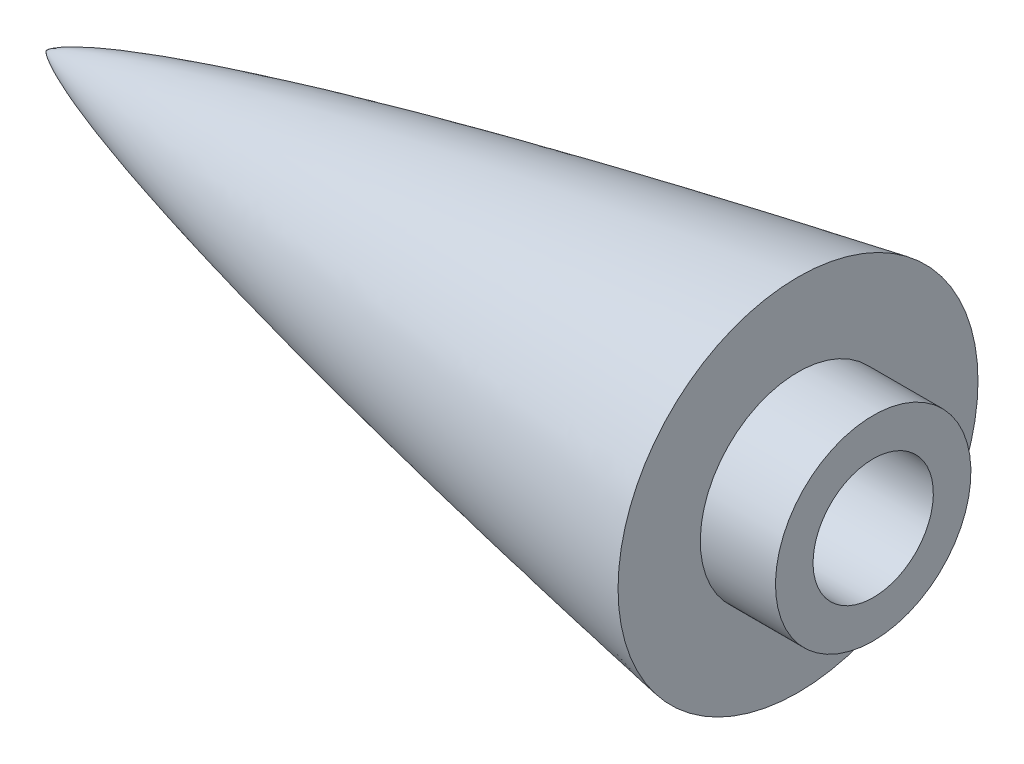
ISO-10303-21;
HEADER;
FILE_DESCRIPTION(('STEP AP214'),'2;1');
FILE_NAME('part.step','',(''),(''),'','','');
FILE_SCHEMA(('AUTOMOTIVE_DESIGN { 1 0 10303 214 1 1 1 1 }'));
ENDSEC;
DATA;
#1=APPLICATION_CONTEXT('core data for automotive mechanical design processes');
#2=APPLICATION_PROTOCOL_DEFINITION('international standard','automotive_design',2000,#1);
#3=PRODUCT_CONTEXT('',#1,'mechanical');
#4=PRODUCT('Part','Part','',(#3));
#5=PRODUCT_RELATED_PRODUCT_CATEGORY('part','',(#4));
#6=PRODUCT_DEFINITION_FORMATION('','',#4);
#7=PRODUCT_DEFINITION_CONTEXT('part definition',#1,'design');
#8=PRODUCT_DEFINITION('design','',#6,#7);
#9=PRODUCT_DEFINITION_SHAPE('','',#8);
#10=(LENGTH_UNIT() NAMED_UNIT(*) SI_UNIT(.MILLI.,.METRE.));
#11=(NAMED_UNIT(*) PLANE_ANGLE_UNIT() SI_UNIT($,.RADIAN.));
#12=(NAMED_UNIT(*) SI_UNIT($,.STERADIAN.) SOLID_ANGLE_UNIT());
#13=UNCERTAINTY_MEASURE_WITH_UNIT(LENGTH_MEASURE(1.E-05),#10,'distance_accuracy_value','');
#14=(GEOMETRIC_REPRESENTATION_CONTEXT(3) GLOBAL_UNCERTAINTY_ASSIGNED_CONTEXT((#13)) GLOBAL_UNIT_ASSIGNED_CONTEXT((#10,
#11,#12)) REPRESENTATION_CONTEXT('',''));
#15=CARTESIAN_POINT('',(0.,0.,0.));
#16=DIRECTION('',(0.,0.,1.));
#17=DIRECTION('',(1.,0.,0.));
#18=AXIS2_PLACEMENT_3D('',#15,#16,#17);
#19=CARTESIAN_POINT('',(69.9269120789832,8.255,0.));
#20=DIRECTION('',(-1.,0.,0.));
#21=DIRECTION('',(0.,-1.,0.));
#22=AXIS2_PLACEMENT_3D('',#19,#20,#21);
#23=PLANE('',#22);
#24=CARTESIAN_POINT('',(69.9269120789832,0.,0.));
#25=DIRECTION('',(1.,0.,0.));
#26=DIRECTION('',(0.,1.,0.));
#27=AXIS2_PLACEMENT_3D('',#24,#25,#26);
#28=CIRCLE('',#27,5.08);
#29=CARTESIAN_POINT('',(69.9269120789832,5.07999999999998,0.));
#30=VERTEX_POINT('',#29);
#31=EDGE_CURVE('E70',#30,#30,#28,.T.);
#32=ORIENTED_EDGE('',*,*,#31,.F.);
#33=EDGE_LOOP('',(#32));
#34=FACE_BOUND('',#33,.T.);
#35=CARTESIAN_POINT('',(69.9269120789832,0.,0.));
#36=DIRECTION('',(-1.,0.,0.));
#37=DIRECTION('',(0.,-1.,0.));
#38=AXIS2_PLACEMENT_3D('',#35,#36,#37);
#39=CIRCLE('',#38,8.25500000000001);
#40=CARTESIAN_POINT('',(69.9269120789832,-8.25500000000003,0.));
#41=VERTEX_POINT('',#40);
#42=EDGE_CURVE('E11',#41,#41,#39,.T.);
#43=ORIENTED_EDGE('',*,*,#42,.F.);
#44=EDGE_LOOP('',(#43));
#45=FACE_BOUND('',#44,.T.);
#46=ADVANCED_FACE('F43',(#34,#45),#23,.F.);
#47=CARTESIAN_POINT('',(0.0769120789613087,0.,0.));
#48=DIRECTION('',(-1.,0.,0.));
#49=DIRECTION('',(0.,-1.,0.));
#50=AXIS2_PLACEMENT_3D('',#47,#48,#49);
#51=CYLINDRICAL_SURFACE('',#50,8.25500000000001);
#52=CARTESIAN_POINT('',(63.5769120789832,0.,0.));
#53=DIRECTION('',(-1.,0.,0.));
#54=DIRECTION('',(0.,-1.,0.));
#55=AXIS2_PLACEMENT_3D('',#52,#53,#54);
#56=CIRCLE('',#55,8.25500000000001);
#57=CARTESIAN_POINT('',(63.5769120789832,-8.25500000000003,0.));
#58=VERTEX_POINT('',#57);
#59=EDGE_CURVE('E50',#58,#58,#56,.T.);
#60=ORIENTED_EDGE('',*,*,#59,.F.);
#61=EDGE_LOOP('',(#60));
#62=FACE_BOUND('',#61,.T.);
#63=ORIENTED_EDGE('',*,*,#42,.T.);
#64=EDGE_LOOP('',(#63));
#65=FACE_BOUND('',#64,.T.);
#66=ADVANCED_FACE('F84',(#62,#65),#51,.T.);
#67=CARTESIAN_POINT('',(63.5769120790633,15.2023278628561,0.));
#68=DIRECTION('',(-1.,0.,0.));
#69=DIRECTION('',(0.,-1.,0.));
#70=AXIS2_PLACEMENT_3D('',#67,#68,#69);
#71=PLANE('',#70);
#72=CARTESIAN_POINT('',(63.5769120791434,0.,0.));
#73=DIRECTION('',(-1.,0.,0.));
#74=DIRECTION('',(0.,-1.,0.));
#75=AXIS2_PLACEMENT_3D('',#72,#73,#74);
#76=CIRCLE('',#75,15.2023278628844);
#77=CARTESIAN_POINT('',(63.5769120791434,-15.2023278628844,0.));
#78=VERTEX_POINT('',#77);
#79=EDGE_CURVE('E61',#78,#78,#76,.T.);
#80=ORIENTED_EDGE('',*,*,#79,.F.);
#81=EDGE_LOOP('',(#80));
#82=FACE_BOUND('',#81,.T.);
#83=ORIENTED_EDGE('',*,*,#59,.T.);
#84=EDGE_LOOP('',(#83));
#85=FACE_BOUND('',#84,.T.);
#86=ADVANCED_FACE('F57',(#82,#85),#71,.F.);
#87=CARTESIAN_POINT('',(63.5769120791434,15.2023278628844,0.));
#88=CARTESIAN_POINT('',(62.4923758436432,15.0110282201915,0.));
#89=CARTESIAN_POINT('',(60.9139535217447,14.730387672016,0.));
#90=CARTESIAN_POINT('',(57.8934162346644,14.1899940922244,0.));
#91=CARTESIAN_POINT('',(55.4099369624681,13.7341428678128,0.));
#92=CARTESIAN_POINT('',(52.7752415439312,13.2499556764684,0.));
#93=CARTESIAN_POINT('',(49.9452838935384,12.7196086324135,0.));
#94=CARTESIAN_POINT('',(46.2903870371847,12.0259331057981,0.));
#95=CARTESIAN_POINT('',(42.1915782774292,11.2274959541961,0.));
#96=CARTESIAN_POINT('',(37.4130759518091,10.2699645000119,0.));
#97=CARTESIAN_POINT('',(32.6950081523898,9.29054771390999,0.));
#98=CARTESIAN_POINT('',(27.9530678087417,8.26874725610363,0.));
#99=CARTESIAN_POINT('',(23.2398821141679,7.20645990581726,0.));
#100=CARTESIAN_POINT('',(18.5274600457783,6.08758867046213,0.));
#101=CARTESIAN_POINT('',(13.8396625515087,4.90002270014625,0.));
#102=CARTESIAN_POINT('',(9.6862186693185,3.7550819941274,0.));
#103=CARTESIAN_POINT('',(6.27467090078362,2.71197441892096,0.));
#104=CARTESIAN_POINT('',(3.78577847126945,1.84589403978008,0.));
#105=CARTESIAN_POINT('',(2.3103971777234,1.26337784321216,0.));
#106=CARTESIAN_POINT('',(1.3930904447892,0.849562336121356,0.));
#107=CARTESIAN_POINT('',(0.86543010693883,0.578065399017136,0.));
#108=CARTESIAN_POINT('',(0.559011436326079,0.399466477150022,0.));
#109=CARTESIAN_POINT('',(0.377989497609549,0.280420084168094,0.));
#110=CARTESIAN_POINT('',(0.268241975259672,0.199491093104646,0.));
#111=CARTESIAN_POINT('',(0.200164991905419,0.143430217457532,0.));
#112=CARTESIAN_POINT('',(0.154037070797407,0.101030826870187,0.));
#113=CARTESIAN_POINT('',(0.122193786166037,0.0681811484452933,0.));
#114=CARTESIAN_POINT('',(0.0990151487408164,0.0402149377238572,0.));
#115=CARTESIAN_POINT('',(0.0844935008835427,0.0193316393016006,0.));
#116=CARTESIAN_POINT('',(0.0789694415718186,0.00665489696774093,0.));
#117=CARTESIAN_POINT('',(0.0769120789612943,0.,0.));
#118=B_SPLINE_CURVE_WITH_KNOTS('',4,(#87,#88,#89,#90,#91,#92,#93,#94,#95,#96,#97,#98,#99,#100,
#101,#102,#103,#104,#105,#106,#107,#108,#109,#110,#111,#112,#113,#114,#115,#116,#117),
.UNSPECIFIED.,.F.,.F.,(5,1,1,1,1,1,1,1,1,1,1,1,1,1,1,1,1,1,1,1,1,1,1,1,1,1,1,5),(0.,
0.0672687336950171,0.100903100683756,0.134537467672494,0.168171835128657,0.201806202584819,
0.269074936547396,0.336343670718147,0.40361240462416,0.47088114061433,0.538149873570357,
0.605418607432971,0.672687341952286,0.739956068585237,0.807224799818527,0.844865203375122,
0.871099329119654,0.886428170388763,0.895424830985231,0.900792367495321,0.904090272056147,
0.906138934513876,0.907468833188649,0.90837138775151,0.908991652106118,0.90962278378138,
0.910008526959893,0.910394270138406),.UNSPECIFIED.);
#119=CARTESIAN_POINT('',(0.0769120789613087,0.,0.));
#120=DIRECTION('',(-1.,0.,0.));
#121=AXIS1_PLACEMENT('',#119,#120);
#122=SURFACE_OF_REVOLUTION('',#118,#121);
#123=CARTESIAN_POINT('',(0.0769120789613087,0.,0.));
#124=VERTEX_POINT('',#123);
#125=VERTEX_LOOP('',#124);
#126=FACE_BOUND('',#125,.T.);
#127=ORIENTED_EDGE('',*,*,#79,.T.);
#128=EDGE_LOOP('',(#127));
#129=FACE_BOUND('',#128,.T.);
#130=ADVANCED_FACE('F53',(#126,#129),#122,.T.);
#131=CARTESIAN_POINT('',(53.4169120789832,0.,0.));
#132=DIRECTION('',(1.,0.,0.));
#133=DIRECTION('',(0.,1.,0.));
#134=AXIS2_PLACEMENT_3D('',#131,#132,#133);
#135=CYLINDRICAL_SURFACE('',#134,5.08);
#136=CARTESIAN_POINT('',(53.4169120789832,0.,0.));
#137=DIRECTION('',(1.,0.,0.));
#138=DIRECTION('',(0.,1.,0.));
#139=AXIS2_PLACEMENT_3D('',#136,#137,#138);
#140=CIRCLE('',#139,5.08);
#141=CARTESIAN_POINT('',(53.4169120789832,5.07999999999998,0.));
#142=VERTEX_POINT('',#141);
#143=EDGE_CURVE('E64',#142,#142,#140,.T.);
#144=ORIENTED_EDGE('',*,*,#143,.F.);
#145=EDGE_LOOP('',(#144));
#146=FACE_BOUND('',#145,.T.);
#147=ORIENTED_EDGE('',*,*,#31,.T.);
#148=EDGE_LOOP('',(#147));
#149=FACE_BOUND('',#148,.T.);
#150=ADVANCED_FACE('F56',(#146,#149),#135,.F.);
#151=CARTESIAN_POINT('',(53.4169120789832,0.,0.));
#152=DIRECTION('',(1.,0.,0.));
#153=DIRECTION('',(0.,1.,0.));
#154=AXIS2_PLACEMENT_3D('',#151,#152,#153);
#155=PLANE('',#154);
#156=ORIENTED_EDGE('',*,*,#143,.T.);
#157=EDGE_LOOP('',(#156));
#158=FACE_BOUND('',#157,.T.);
#159=ADVANCED_FACE('F103',(#158),#155,.T.);
#160=CLOSED_SHELL('',(#46,#66,#86,#130,#150,#159));
#161=MANIFOLD_SOLID_BREP('B2',#160);
#162=ADVANCED_BREP_SHAPE_REPRESENTATION('',(#18,#161),#14);
#163=SHAPE_DEFINITION_REPRESENTATION(#9,#162);
ENDSEC;
END-ISO-10303-21;
